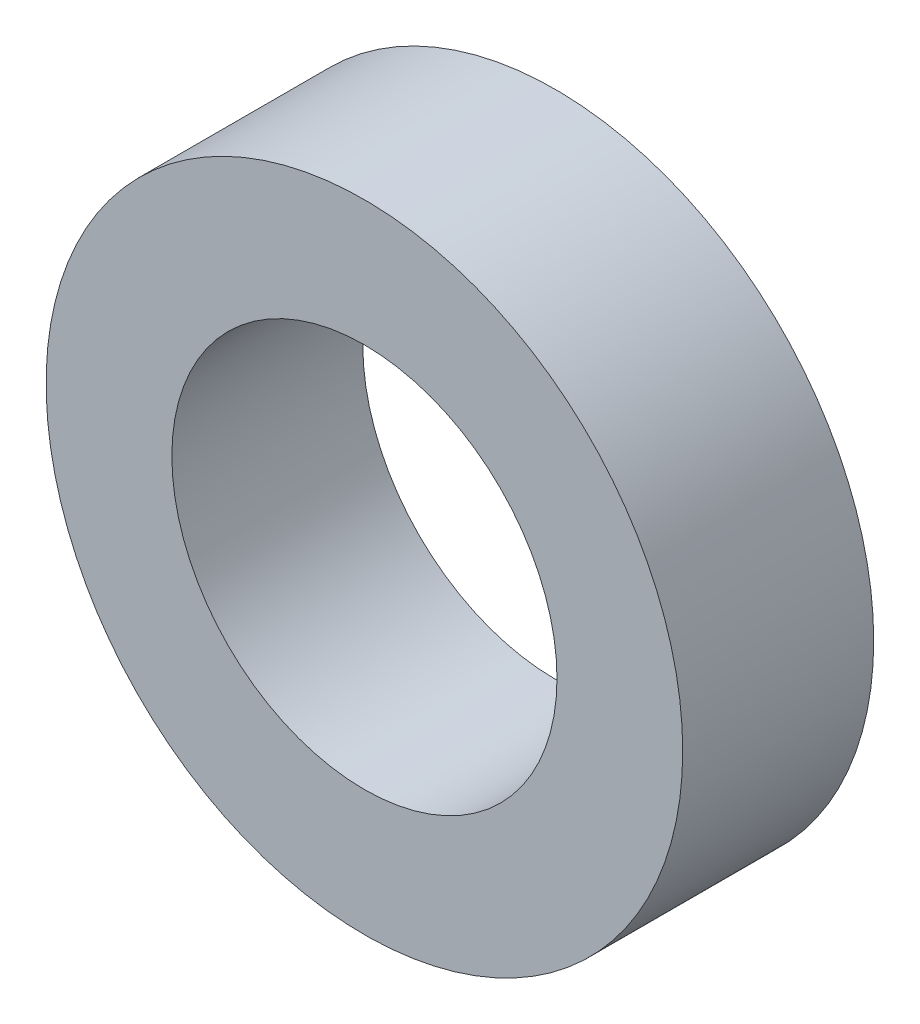
ISO-10303-21;
HEADER;
FILE_DESCRIPTION(('STEP AP214'),'2;1');
FILE_NAME('part.step','',(''),(''),'','','');
FILE_SCHEMA(('AUTOMOTIVE_DESIGN { 1 0 10303 214 1 1 1 1 }'));
ENDSEC;
DATA;
#1=APPLICATION_CONTEXT('core data for automotive mechanical design processes');
#2=APPLICATION_PROTOCOL_DEFINITION('international standard','automotive_design',2000,#1);
#3=PRODUCT_CONTEXT('',#1,'mechanical');
#4=PRODUCT('Part','Part','',(#3));
#5=PRODUCT_RELATED_PRODUCT_CATEGORY('part','',(#4));
#6=PRODUCT_DEFINITION_FORMATION('','',#4);
#7=PRODUCT_DEFINITION_CONTEXT('part definition',#1,'design');
#8=PRODUCT_DEFINITION('design','',#6,#7);
#9=PRODUCT_DEFINITION_SHAPE('','',#8);
#10=(LENGTH_UNIT() NAMED_UNIT(*) SI_UNIT(.MILLI.,.METRE.));
#11=(NAMED_UNIT(*) PLANE_ANGLE_UNIT() SI_UNIT($,.RADIAN.));
#12=(NAMED_UNIT(*) SI_UNIT($,.STERADIAN.) SOLID_ANGLE_UNIT());
#13=UNCERTAINTY_MEASURE_WITH_UNIT(LENGTH_MEASURE(1.E-05),#10,'distance_accuracy_value','');
#14=(GEOMETRIC_REPRESENTATION_CONTEXT(3) GLOBAL_UNCERTAINTY_ASSIGNED_CONTEXT((#13)) GLOBAL_UNIT_ASSIGNED_CONTEXT((#10,
#11,#12)) REPRESENTATION_CONTEXT('',''));
#15=CARTESIAN_POINT('',(0.,0.,0.));
#16=DIRECTION('',(0.,0.,1.));
#17=DIRECTION('',(1.,0.,0.));
#18=AXIS2_PLACEMENT_3D('',#15,#16,#17);
#19=CARTESIAN_POINT('',(0.,0.,3.));
#20=DIRECTION('',(0.,0.,1.));
#21=DIRECTION('',(1.,0.,0.));
#22=AXIS2_PLACEMENT_3D('',#19,#20,#21);
#23=PLANE('',#22);
#24=CARTESIAN_POINT('',(0.,0.,3.));
#25=DIRECTION('',(0.,0.,1.));
#26=DIRECTION('',(1.,0.,0.));
#27=AXIS2_PLACEMENT_3D('',#24,#25,#26);
#28=CIRCLE('',#27,5.);
#29=CARTESIAN_POINT('',(5.,0.,3.));
#30=VERTEX_POINT('',#29);
#31=EDGE_CURVE('E10',#30,#30,#28,.T.);
#32=ORIENTED_EDGE('',*,*,#31,.T.);
#33=EDGE_LOOP('',(#32));
#34=FACE_BOUND('',#33,.T.);
#35=CARTESIAN_POINT('',(0.,0.,3.));
#36=DIRECTION('',(0.,0.,1.));
#37=DIRECTION('',(1.,0.,0.));
#38=AXIS2_PLACEMENT_3D('',#35,#36,#37);
#39=CIRCLE('',#38,3.025);
#40=CARTESIAN_POINT('',(3.025,0.,3.));
#41=VERTEX_POINT('',#40);
#42=EDGE_CURVE('E50',#41,#41,#39,.T.);
#43=ORIENTED_EDGE('',*,*,#42,.F.);
#44=EDGE_LOOP('',(#43));
#45=FACE_BOUND('',#44,.T.);
#46=ADVANCED_FACE('F39',(#34,#45),#23,.T.);
#47=CARTESIAN_POINT('',(0.,0.,0.));
#48=DIRECTION('',(0.,0.,1.));
#49=DIRECTION('',(1.,0.,0.));
#50=AXIS2_PLACEMENT_3D('',#47,#48,#49);
#51=PLANE('',#50);
#52=CARTESIAN_POINT('',(0.,0.,0.));
#53=DIRECTION('',(0.,0.,1.));
#54=DIRECTION('',(1.,0.,0.));
#55=AXIS2_PLACEMENT_3D('',#52,#53,#54);
#56=CIRCLE('',#55,5.);
#57=CARTESIAN_POINT('',(5.,0.,0.));
#58=VERTEX_POINT('',#57);
#59=EDGE_CURVE('E43',#58,#58,#56,.T.);
#60=ORIENTED_EDGE('',*,*,#59,.F.);
#61=EDGE_LOOP('',(#60));
#62=FACE_BOUND('',#61,.T.);
#63=CARTESIAN_POINT('',(0.,0.,0.));
#64=DIRECTION('',(0.,0.,1.));
#65=DIRECTION('',(1.,0.,0.));
#66=AXIS2_PLACEMENT_3D('',#63,#64,#65);
#67=CIRCLE('',#66,3.025);
#68=CARTESIAN_POINT('',(3.025,0.,0.));
#69=VERTEX_POINT('',#68);
#70=EDGE_CURVE('E52',#69,#69,#67,.T.);
#71=ORIENTED_EDGE('',*,*,#70,.T.);
#72=EDGE_LOOP('',(#71));
#73=FACE_BOUND('',#72,.T.);
#74=ADVANCED_FACE('F62',(#62,#73),#51,.F.);
#75=CARTESIAN_POINT('',(0.,0.,3.));
#76=DIRECTION('',(0.,0.,-1.));
#77=DIRECTION('',(-1.,0.,0.));
#78=AXIS2_PLACEMENT_3D('',#75,#76,#77);
#79=CYLINDRICAL_SURFACE('',#78,5.);
#80=ORIENTED_EDGE('',*,*,#31,.F.);
#81=EDGE_LOOP('',(#80));
#82=FACE_BOUND('',#81,.T.);
#83=ORIENTED_EDGE('',*,*,#59,.T.);
#84=EDGE_LOOP('',(#83));
#85=FACE_BOUND('',#84,.T.);
#86=ADVANCED_FACE('F41',(#82,#85),#79,.T.);
#87=CARTESIAN_POINT('',(0.,0.,3.));
#88=DIRECTION('',(0.,0.,-1.));
#89=DIRECTION('',(-1.,0.,0.));
#90=AXIS2_PLACEMENT_3D('',#87,#88,#89);
#91=CYLINDRICAL_SURFACE('',#90,3.025);
#92=ORIENTED_EDGE('',*,*,#42,.T.);
#93=EDGE_LOOP('',(#92));
#94=FACE_BOUND('',#93,.T.);
#95=ORIENTED_EDGE('',*,*,#70,.F.);
#96=EDGE_LOOP('',(#95));
#97=FACE_BOUND('',#96,.T.);
#98=ADVANCED_FACE('F58',(#94,#97),#91,.F.);
#99=CLOSED_SHELL('',(#46,#74,#86,#98));
#100=MANIFOLD_SOLID_BREP('B2',#99);
#101=ADVANCED_BREP_SHAPE_REPRESENTATION('',(#18,#100),#14);
#102=SHAPE_DEFINITION_REPRESENTATION(#9,#101);
ENDSEC;
END-ISO-10303-21;
